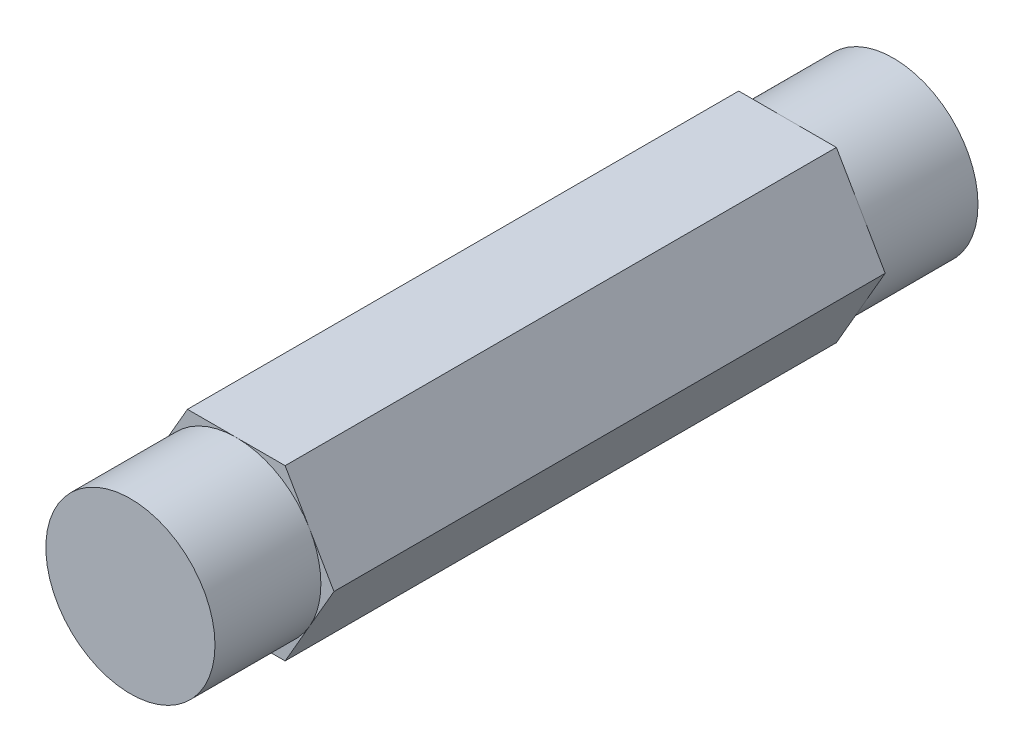
ISO-10303-21;
HEADER;
FILE_DESCRIPTION(('STEP AP214'),'2;1');
FILE_NAME('part.step','',(''),(''),'','','');
FILE_SCHEMA(('AUTOMOTIVE_DESIGN { 1 0 10303 214 1 1 1 1 }'));
ENDSEC;
DATA;
#1=APPLICATION_CONTEXT('core data for automotive mechanical design processes');
#2=APPLICATION_PROTOCOL_DEFINITION('international standard','automotive_design',2000,#1);
#3=PRODUCT_CONTEXT('',#1,'mechanical');
#4=PRODUCT('Part','Part','',(#3));
#5=PRODUCT_RELATED_PRODUCT_CATEGORY('part','',(#4));
#6=PRODUCT_DEFINITION_FORMATION('','',#4);
#7=PRODUCT_DEFINITION_CONTEXT('part definition',#1,'design');
#8=PRODUCT_DEFINITION('design','',#6,#7);
#9=PRODUCT_DEFINITION_SHAPE('','',#8);
#10=(LENGTH_UNIT() NAMED_UNIT(*) SI_UNIT(.MILLI.,.METRE.));
#11=(NAMED_UNIT(*) PLANE_ANGLE_UNIT() SI_UNIT($,.RADIAN.));
#12=(NAMED_UNIT(*) SI_UNIT($,.STERADIAN.) SOLID_ANGLE_UNIT());
#13=UNCERTAINTY_MEASURE_WITH_UNIT(LENGTH_MEASURE(1.E-05),#10,'distance_accuracy_value','');
#14=(GEOMETRIC_REPRESENTATION_CONTEXT(3) GLOBAL_UNCERTAINTY_ASSIGNED_CONTEXT((#13)) GLOBAL_UNIT_ASSIGNED_CONTEXT((#10,
#11,#12)) REPRESENTATION_CONTEXT('',''));
#15=CARTESIAN_POINT('',(0.,0.,0.));
#16=DIRECTION('',(0.,0.,1.));
#17=DIRECTION('',(1.,0.,0.));
#18=AXIS2_PLACEMENT_3D('',#15,#16,#17);
#19=CARTESIAN_POINT('',(0.,-6.35,28.64485));
#20=DIRECTION('',(0.,1.,0.));
#21=DIRECTION('',(-1.,0.,0.));
#22=AXIS2_PLACEMENT_3D('',#19,#20,#21);
#23=PLANE('',#22);
#24=DIRECTION('',(-1.,0.,0.));
#25=VECTOR('',#24,1.);
#26=CARTESIAN_POINT('',(0.,-6.35,-20.69465));
#27=LINE('',#26,#25);
#28=CARTESIAN_POINT('',(3.66617420935412,-6.35,-20.69465));
#29=VERTEX_POINT('',#28);
#30=CARTESIAN_POINT('',(0.,-6.35,-20.69465));
#31=VERTEX_POINT('',#30);
#32=EDGE_CURVE('E315',#29,#31,#27,.T.);
#33=ORIENTED_EDGE('',*,*,#32,.F.);
#34=DIRECTION('',(0.,0.,-1.));
#35=VECTOR('',#34,1.);
#36=CARTESIAN_POINT('',(3.66617420935412,-6.35,28.64485));
#37=LINE('',#36,#35);
#38=CARTESIAN_POINT('',(3.66617420935412,-6.35,20.69465));
#39=VERTEX_POINT('',#38);
#40=EDGE_CURVE('E228',#39,#29,#37,.T.);
#41=ORIENTED_EDGE('',*,*,#40,.F.);
#42=DIRECTION('',(1.,0.,0.));
#43=VECTOR('',#42,1.);
#44=CARTESIAN_POINT('',(0.,-6.35,20.69465));
#45=LINE('',#44,#43);
#46=CARTESIAN_POINT('',(0.,-6.35,20.69465));
#47=VERTEX_POINT('',#46);
#48=EDGE_CURVE('E207',#47,#39,#45,.T.);
#49=ORIENTED_EDGE('',*,*,#48,.F.);
#50=CARTESIAN_POINT('',(-3.66617420935412,-6.35,20.69465));
#51=VERTEX_POINT('',#50);
#52=EDGE_CURVE('E210',#51,#47,#45,.T.);
#53=ORIENTED_EDGE('',*,*,#52,.F.);
#54=DIRECTION('',(0.,0.,-1.));
#55=VECTOR('',#54,1.);
#56=CARTESIAN_POINT('',(-3.66617420935412,-6.35,28.64485));
#57=LINE('',#56,#55);
#58=CARTESIAN_POINT('',(-3.66617420935412,-6.35,-20.69465));
#59=VERTEX_POINT('',#58);
#60=EDGE_CURVE('E211',#51,#59,#57,.T.);
#61=ORIENTED_EDGE('',*,*,#60,.T.);
#62=EDGE_CURVE('E305',#31,#59,#27,.T.);
#63=ORIENTED_EDGE('',*,*,#62,.F.);
#64=EDGE_LOOP('',(#33,#41,#49,#53,#61,#63));
#65=FACE_BOUND('',#64,.T.);
#66=ADVANCED_FACE('F49',(#65),#23,.F.);
#67=CARTESIAN_POINT('',(5.49926131403119,-3.175,28.64485));
#68=DIRECTION('',(-0.866025403784439,0.5,0.));
#69=DIRECTION('',(-0.5,-0.866025403784439,0.));
#70=AXIS2_PLACEMENT_3D('',#67,#68,#69);
#71=PLANE('',#70);
#72=DIRECTION('',(-0.5,-0.866025403784439,0.));
#73=VECTOR('',#72,1.);
#74=CARTESIAN_POINT('',(5.49926131403119,-3.175,-20.69465));
#75=LINE('',#74,#73);
#76=CARTESIAN_POINT('',(7.33234841870825,0.,-20.69465));
#77=VERTEX_POINT('',#76);
#78=CARTESIAN_POINT('',(5.49926131403119,-3.175,-20.69465));
#79=VERTEX_POINT('',#78);
#80=EDGE_CURVE('E160',#77,#79,#75,.T.);
#81=ORIENTED_EDGE('',*,*,#80,.F.);
#82=DIRECTION('',(0.,0.,-1.));
#83=VECTOR('',#82,1.);
#84=CARTESIAN_POINT('',(7.33234841870825,0.,28.64485));
#85=LINE('',#84,#83);
#86=CARTESIAN_POINT('',(7.33234841870825,0.,20.69465));
#87=VERTEX_POINT('',#86);
#88=EDGE_CURVE('E178',#87,#77,#85,.T.);
#89=ORIENTED_EDGE('',*,*,#88,.F.);
#90=DIRECTION('',(0.5,0.866025403784439,0.));
#91=VECTOR('',#90,1.);
#92=CARTESIAN_POINT('',(5.49926131403119,-3.175,20.69465));
#93=LINE('',#92,#91);
#94=CARTESIAN_POINT('',(5.49926131403119,-3.175,20.69465));
#95=VERTEX_POINT('',#94);
#96=EDGE_CURVE('E203',#95,#87,#93,.T.);
#97=ORIENTED_EDGE('',*,*,#96,.F.);
#98=EDGE_CURVE('E206',#39,#95,#93,.T.);
#99=ORIENTED_EDGE('',*,*,#98,.F.);
#100=ORIENTED_EDGE('',*,*,#40,.T.);
#101=EDGE_CURVE('E185',#79,#29,#75,.T.);
#102=ORIENTED_EDGE('',*,*,#101,.F.);
#103=EDGE_LOOP('',(#81,#89,#97,#99,#100,#102));
#104=FACE_BOUND('',#103,.T.);
#105=ADVANCED_FACE('F326',(#104),#71,.F.);
#106=CARTESIAN_POINT('',(5.49926131403119,3.175,28.64485));
#107=DIRECTION('',(-0.866025403784438,-0.5,0.));
#108=DIRECTION('',(0.5,-0.866025403784439,0.));
#109=AXIS2_PLACEMENT_3D('',#106,#107,#108);
#110=PLANE('',#109);
#111=DIRECTION('',(0.5,-0.866025403784439,0.));
#112=VECTOR('',#111,1.);
#113=CARTESIAN_POINT('',(5.49926131403119,3.175,-20.69465));
#114=LINE('',#113,#112);
#115=CARTESIAN_POINT('',(3.66617420935412,6.35,-20.69465));
#116=VERTEX_POINT('',#115);
#117=CARTESIAN_POINT('',(5.49926131403118,3.175,-20.69465));
#118=VERTEX_POINT('',#117);
#119=EDGE_CURVE('E140',#116,#118,#114,.T.);
#120=ORIENTED_EDGE('',*,*,#119,.F.);
#121=DIRECTION('',(0.,0.,-1.));
#122=VECTOR('',#121,1.);
#123=CARTESIAN_POINT('',(3.66617420935412,6.35,28.64485));
#124=LINE('',#123,#122);
#125=CARTESIAN_POINT('',(3.66617420935412,6.35,20.69465));
#126=VERTEX_POINT('',#125);
#127=EDGE_CURVE('E223',#126,#116,#124,.T.);
#128=ORIENTED_EDGE('',*,*,#127,.F.);
#129=DIRECTION('',(-0.5,0.866025403784439,0.));
#130=VECTOR('',#129,1.);
#131=CARTESIAN_POINT('',(5.49926131403119,3.175,20.69465));
#132=LINE('',#131,#130);
#133=CARTESIAN_POINT('',(5.49926131403118,3.175,20.69465));
#134=VERTEX_POINT('',#133);
#135=EDGE_CURVE('E199',#134,#126,#132,.T.);
#136=ORIENTED_EDGE('',*,*,#135,.F.);
#137=EDGE_CURVE('E202',#87,#134,#132,.T.);
#138=ORIENTED_EDGE('',*,*,#137,.F.);
#139=ORIENTED_EDGE('',*,*,#88,.T.);
#140=EDGE_CURVE('E153',#118,#77,#114,.T.);
#141=ORIENTED_EDGE('',*,*,#140,.F.);
#142=EDGE_LOOP('',(#120,#128,#136,#138,#139,#141));
#143=FACE_BOUND('',#142,.T.);
#144=ADVANCED_FACE('F175',(#143),#110,.F.);
#145=CARTESIAN_POINT('',(0.,6.35,28.64485));
#146=DIRECTION('',(0.,-1.,0.));
#147=DIRECTION('',(1.,0.,0.));
#148=AXIS2_PLACEMENT_3D('',#145,#146,#147);
#149=PLANE('',#148);
#150=DIRECTION('',(1.,0.,0.));
#151=VECTOR('',#150,1.);
#152=CARTESIAN_POINT('',(0.,6.35,-20.69465));
#153=LINE('',#152,#151);
#154=CARTESIAN_POINT('',(-3.66617420935412,6.35,-20.69465));
#155=VERTEX_POINT('',#154);
#156=CARTESIAN_POINT('',(0.,6.35,-20.69465));
#157=VERTEX_POINT('',#156);
#158=EDGE_CURVE('E182',#155,#157,#153,.T.);
#159=ORIENTED_EDGE('',*,*,#158,.F.);
#160=DIRECTION('',(0.,0.,-1.));
#161=VECTOR('',#160,1.);
#162=CARTESIAN_POINT('',(-3.66617420935412,6.35,28.64485));
#163=LINE('',#162,#161);
#164=CARTESIAN_POINT('',(-3.66617420935412,6.35,20.69465));
#165=VERTEX_POINT('',#164);
#166=EDGE_CURVE('E219',#165,#155,#163,.T.);
#167=ORIENTED_EDGE('',*,*,#166,.F.);
#168=DIRECTION('',(-1.,0.,0.));
#169=VECTOR('',#168,1.);
#170=CARTESIAN_POINT('',(0.,6.35,20.69465));
#171=LINE('',#170,#169);
#172=CARTESIAN_POINT('',(0.,6.35,20.69465));
#173=VERTEX_POINT('',#172);
#174=EDGE_CURVE('E195',#173,#165,#171,.T.);
#175=ORIENTED_EDGE('',*,*,#174,.F.);
#176=EDGE_CURVE('E198',#126,#173,#171,.T.);
#177=ORIENTED_EDGE('',*,*,#176,.F.);
#178=ORIENTED_EDGE('',*,*,#127,.T.);
#179=EDGE_CURVE('E146',#157,#116,#153,.T.);
#180=ORIENTED_EDGE('',*,*,#179,.F.);
#181=EDGE_LOOP('',(#159,#167,#175,#177,#178,#180));
#182=FACE_BOUND('',#181,.T.);
#183=ADVANCED_FACE('F293',(#182),#149,.F.);
#184=CARTESIAN_POINT('',(-5.49926131403118,3.175,28.64485));
#185=DIRECTION('',(0.866025403784439,-0.5,0.));
#186=DIRECTION('',(0.5,0.866025403784439,0.));
#187=AXIS2_PLACEMENT_3D('',#184,#185,#186);
#188=PLANE('',#187);
#189=DIRECTION('',(0.5,0.866025403784439,0.));
#190=VECTOR('',#189,1.);
#191=CARTESIAN_POINT('',(-5.49926131403118,3.175,-20.69465));
#192=LINE('',#191,#190);
#193=CARTESIAN_POINT('',(-7.33234841870824,0.,-20.69465));
#194=VERTEX_POINT('',#193);
#195=CARTESIAN_POINT('',(-5.49926131403119,3.175,-20.69465));
#196=VERTEX_POINT('',#195);
#197=EDGE_CURVE('E173',#194,#196,#192,.T.);
#198=ORIENTED_EDGE('',*,*,#197,.F.);
#199=DIRECTION('',(0.,0.,-1.));
#200=VECTOR('',#199,1.);
#201=CARTESIAN_POINT('',(-7.33234841870824,0.,28.64485));
#202=LINE('',#201,#200);
#203=CARTESIAN_POINT('',(-7.33234841870824,0.,20.69465));
#204=VERTEX_POINT('',#203);
#205=EDGE_CURVE('E215',#204,#194,#202,.T.);
#206=ORIENTED_EDGE('',*,*,#205,.F.);
#207=DIRECTION('',(-0.5,-0.866025403784439,0.));
#208=VECTOR('',#207,1.);
#209=CARTESIAN_POINT('',(-5.49926131403118,3.175,20.69465));
#210=LINE('',#209,#208);
#211=CARTESIAN_POINT('',(-5.49926131403119,3.175,20.69465));
#212=VERTEX_POINT('',#211);
#213=EDGE_CURVE('E190',#212,#204,#210,.T.);
#214=ORIENTED_EDGE('',*,*,#213,.F.);
#215=EDGE_CURVE('E194',#165,#212,#210,.T.);
#216=ORIENTED_EDGE('',*,*,#215,.F.);
#217=ORIENTED_EDGE('',*,*,#166,.T.);
#218=EDGE_CURVE('E307',#196,#155,#192,.T.);
#219=ORIENTED_EDGE('',*,*,#218,.F.);
#220=EDGE_LOOP('',(#198,#206,#214,#216,#217,#219));
#221=FACE_BOUND('',#220,.T.);
#222=ADVANCED_FACE('F300',(#221),#188,.F.);
#223=CARTESIAN_POINT('',(-5.49926131403118,-3.175,28.64485));
#224=DIRECTION('',(0.866025403784439,0.5,0.));
#225=DIRECTION('',(-0.5,0.866025403784439,0.));
#226=AXIS2_PLACEMENT_3D('',#223,#224,#225);
#227=PLANE('',#226);
#228=DIRECTION('',(-0.5,0.866025403784439,0.));
#229=VECTOR('',#228,1.);
#230=CARTESIAN_POINT('',(-5.49926131403118,-3.175,-20.69465));
#231=LINE('',#230,#229);
#232=CARTESIAN_POINT('',(-5.49926131403118,-3.175,-20.69465));
#233=VERTEX_POINT('',#232);
#234=EDGE_CURVE('E12',#59,#233,#231,.T.);
#235=ORIENTED_EDGE('',*,*,#234,.F.);
#236=ORIENTED_EDGE('',*,*,#60,.F.);
#237=DIRECTION('',(0.5,-0.866025403784439,0.));
#238=VECTOR('',#237,1.);
#239=CARTESIAN_POINT('',(-5.49926131403118,-3.175,20.69465));
#240=LINE('',#239,#238);
#241=CARTESIAN_POINT('',(-5.49926131403118,-3.175,20.69465));
#242=VERTEX_POINT('',#241);
#243=EDGE_CURVE('E236',#242,#51,#240,.T.);
#244=ORIENTED_EDGE('',*,*,#243,.F.);
#245=EDGE_CURVE('E238',#204,#242,#240,.T.);
#246=ORIENTED_EDGE('',*,*,#245,.F.);
#247=ORIENTED_EDGE('',*,*,#205,.T.);
#248=EDGE_CURVE('E52',#233,#194,#231,.T.);
#249=ORIENTED_EDGE('',*,*,#248,.F.);
#250=EDGE_LOOP('',(#235,#236,#244,#246,#247,#249));
#251=FACE_BOUND('',#250,.T.);
#252=ADVANCED_FACE('F256',(#251),#227,.F.);
#253=CARTESIAN_POINT('',(0.,0.,20.69465));
#254=DIRECTION('',(0.,0.,1.));
#255=DIRECTION('',(1.,0.,0.));
#256=AXIS2_PLACEMENT_3D('',#253,#254,#255);
#257=PLANE('',#256);
#258=ORIENTED_EDGE('',*,*,#52,.T.);
#259=CARTESIAN_POINT('',(0.,0.,20.69465));
#260=DIRECTION('',(0.,0.,1.));
#261=DIRECTION('',(1.,0.,0.));
#262=AXIS2_PLACEMENT_3D('',#259,#260,#261);
#263=CIRCLE('',#262,6.35);
#264=EDGE_CURVE('E261',#242,#47,#263,.T.);
#265=ORIENTED_EDGE('',*,*,#264,.F.);
#266=ORIENTED_EDGE('',*,*,#243,.T.);
#267=EDGE_LOOP('',(#258,#265,#266));
#268=FACE_BOUND('',#267,.T.);
#269=ADVANCED_FACE('F259',(#268),#257,.T.);
#270=ORIENTED_EDGE('',*,*,#48,.T.);
#271=ORIENTED_EDGE('',*,*,#98,.T.);
#272=EDGE_CURVE('E276',#47,#95,#263,.T.);
#273=ORIENTED_EDGE('',*,*,#272,.F.);
#274=EDGE_LOOP('',(#270,#271,#273));
#275=FACE_BOUND('',#274,.T.);
#276=ADVANCED_FACE('F328',(#275),#257,.T.);
#277=ORIENTED_EDGE('',*,*,#96,.T.);
#278=ORIENTED_EDGE('',*,*,#137,.T.);
#279=EDGE_CURVE('E152',#95,#134,#263,.T.);
#280=ORIENTED_EDGE('',*,*,#279,.F.);
#281=EDGE_LOOP('',(#277,#278,#280));
#282=FACE_BOUND('',#281,.T.);
#283=ADVANCED_FACE('F330',(#282),#257,.T.);
#284=ORIENTED_EDGE('',*,*,#135,.T.);
#285=ORIENTED_EDGE('',*,*,#176,.T.);
#286=EDGE_CURVE('E186',#134,#173,#263,.T.);
#287=ORIENTED_EDGE('',*,*,#286,.F.);
#288=EDGE_LOOP('',(#284,#285,#287));
#289=FACE_BOUND('',#288,.T.);
#290=ADVANCED_FACE('F288',(#289),#257,.T.);
#291=ORIENTED_EDGE('',*,*,#174,.T.);
#292=ORIENTED_EDGE('',*,*,#215,.T.);
#293=EDGE_CURVE('E191',#173,#212,#263,.T.);
#294=ORIENTED_EDGE('',*,*,#293,.F.);
#295=EDGE_LOOP('',(#291,#292,#294));
#296=FACE_BOUND('',#295,.T.);
#297=ADVANCED_FACE('F297',(#296),#257,.T.);
#298=ORIENTED_EDGE('',*,*,#213,.T.);
#299=ORIENTED_EDGE('',*,*,#245,.T.);
#300=EDGE_CURVE('E72',#212,#242,#263,.T.);
#301=ORIENTED_EDGE('',*,*,#300,.F.);
#302=EDGE_LOOP('',(#298,#299,#301));
#303=FACE_BOUND('',#302,.T.);
#304=ADVANCED_FACE('F250',(#303),#257,.T.);
#305=CARTESIAN_POINT('',(0.,0.,20.69465));
#306=DIRECTION('',(0.,0.,1.));
#307=DIRECTION('',(1.,0.,0.));
#308=AXIS2_PLACEMENT_3D('',#305,#306,#307);
#309=CYLINDRICAL_SURFACE('',#308,6.35);
#310=CARTESIAN_POINT('',(0.,0.,28.64485));
#311=DIRECTION('',(0.,0.,1.));
#312=DIRECTION('',(1.,0.,0.));
#313=AXIS2_PLACEMENT_3D('',#310,#311,#312);
#314=CIRCLE('',#313,6.35);
#315=CARTESIAN_POINT('',(6.35,0.,28.64485));
#316=VERTEX_POINT('',#315);
#317=EDGE_CURVE('E232',#316,#316,#314,.T.);
#318=ORIENTED_EDGE('',*,*,#317,.F.);
#319=EDGE_LOOP('',(#318));
#320=FACE_BOUND('',#319,.T.);
#321=ORIENTED_EDGE('',*,*,#264,.T.);
#322=ORIENTED_EDGE('',*,*,#272,.T.);
#323=ORIENTED_EDGE('',*,*,#279,.T.);
#324=ORIENTED_EDGE('',*,*,#286,.T.);
#325=ORIENTED_EDGE('',*,*,#293,.T.);
#326=ORIENTED_EDGE('',*,*,#300,.T.);
#327=EDGE_LOOP('',(#321,#322,#323,#324,#325,#326));
#328=FACE_BOUND('',#327,.T.);
#329=ADVANCED_FACE('F282',(#320,#328),#309,.T.);
#330=CARTESIAN_POINT('',(0.,0.,28.64485));
#331=DIRECTION('',(0.,0.,1.));
#332=DIRECTION('',(1.,0.,0.));
#333=AXIS2_PLACEMENT_3D('',#330,#331,#332);
#334=PLANE('',#333);
#335=ORIENTED_EDGE('',*,*,#317,.T.);
#336=EDGE_LOOP('',(#335));
#337=FACE_BOUND('',#336,.T.);
#338=ADVANCED_FACE('F356',(#337),#334,.T.);
#339=CARTESIAN_POINT('',(0.,0.,-20.69465));
#340=DIRECTION('',(0.,0.,-1.));
#341=DIRECTION('',(-1.,0.,0.));
#342=AXIS2_PLACEMENT_3D('',#339,#340,#341);
#343=PLANE('',#342);
#344=ORIENTED_EDGE('',*,*,#119,.T.);
#345=CARTESIAN_POINT('',(0.,0.,-20.69465));
#346=DIRECTION('',(0.,0.,1.));
#347=DIRECTION('',(1.,0.,0.));
#348=AXIS2_PLACEMENT_3D('',#345,#346,#347);
#349=CIRCLE('',#348,6.35);
#350=EDGE_CURVE('E144',#118,#157,#349,.T.);
#351=ORIENTED_EDGE('',*,*,#350,.T.);
#352=ORIENTED_EDGE('',*,*,#179,.T.);
#353=EDGE_LOOP('',(#344,#351,#352));
#354=FACE_BOUND('',#353,.T.);
#355=ADVANCED_FACE('F142',(#354),#343,.T.);
#356=ORIENTED_EDGE('',*,*,#140,.T.);
#357=ORIENTED_EDGE('',*,*,#80,.T.);
#358=EDGE_CURVE('E157',#79,#118,#349,.T.);
#359=ORIENTED_EDGE('',*,*,#358,.T.);
#360=EDGE_LOOP('',(#356,#357,#359));
#361=FACE_BOUND('',#360,.T.);
#362=ADVANCED_FACE('F158',(#361),#343,.T.);
#363=ORIENTED_EDGE('',*,*,#101,.T.);
#364=ORIENTED_EDGE('',*,*,#32,.T.);
#365=EDGE_CURVE('E165',#31,#79,#349,.T.);
#366=ORIENTED_EDGE('',*,*,#365,.T.);
#367=EDGE_LOOP('',(#363,#364,#366));
#368=FACE_BOUND('',#367,.T.);
#369=ADVANCED_FACE('F379',(#368),#343,.T.);
#370=ORIENTED_EDGE('',*,*,#158,.T.);
#371=EDGE_CURVE('E171',#157,#196,#349,.T.);
#372=ORIENTED_EDGE('',*,*,#371,.T.);
#373=ORIENTED_EDGE('',*,*,#218,.T.);
#374=EDGE_LOOP('',(#370,#372,#373));
#375=FACE_BOUND('',#374,.T.);
#376=ADVANCED_FACE('F312',(#375),#343,.T.);
#377=ORIENTED_EDGE('',*,*,#62,.T.);
#378=ORIENTED_EDGE('',*,*,#234,.T.);
#379=EDGE_CURVE('E309',#233,#31,#349,.T.);
#380=ORIENTED_EDGE('',*,*,#379,.T.);
#381=EDGE_LOOP('',(#377,#378,#380));
#382=FACE_BOUND('',#381,.T.);
#383=ADVANCED_FACE('F321',(#382),#343,.T.);
#384=ORIENTED_EDGE('',*,*,#197,.T.);
#385=EDGE_CURVE('E64',#196,#233,#349,.T.);
#386=ORIENTED_EDGE('',*,*,#385,.T.);
#387=ORIENTED_EDGE('',*,*,#248,.T.);
#388=EDGE_LOOP('',(#384,#386,#387));
#389=FACE_BOUND('',#388,.T.);
#390=ADVANCED_FACE('F303',(#389),#343,.T.);
#391=CARTESIAN_POINT('',(0.,0.,-20.69465));
#392=DIRECTION('',(0.,0.,-1.));
#393=DIRECTION('',(-1.,0.,0.));
#394=AXIS2_PLACEMENT_3D('',#391,#392,#393);
#395=CYLINDRICAL_SURFACE('',#394,6.35);
#396=ORIENTED_EDGE('',*,*,#365,.F.);
#397=ORIENTED_EDGE('',*,*,#379,.F.);
#398=ORIENTED_EDGE('',*,*,#385,.F.);
#399=ORIENTED_EDGE('',*,*,#371,.F.);
#400=ORIENTED_EDGE('',*,*,#350,.F.);
#401=ORIENTED_EDGE('',*,*,#358,.F.);
#402=EDGE_LOOP('',(#396,#397,#398,#399,#400,#401));
#403=FACE_BOUND('',#402,.T.);
#404=CARTESIAN_POINT('',(0.,0.,-28.64485));
#405=DIRECTION('',(0.,0.,1.));
#406=DIRECTION('',(1.,0.,0.));
#407=AXIS2_PLACEMENT_3D('',#404,#405,#406);
#408=CIRCLE('',#407,6.35);
#409=CARTESIAN_POINT('',(6.35,0.,-28.64485));
#410=VERTEX_POINT('',#409);
#411=EDGE_CURVE('E239',#410,#410,#408,.F.);
#412=ORIENTED_EDGE('',*,*,#411,.F.);
#413=EDGE_LOOP('',(#412));
#414=FACE_BOUND('',#413,.T.);
#415=ADVANCED_FACE('F168',(#403,#414),#395,.T.);
#416=CARTESIAN_POINT('',(0.,0.,-28.64485));
#417=DIRECTION('',(0.,0.,1.));
#418=DIRECTION('',(1.,0.,0.));
#419=AXIS2_PLACEMENT_3D('',#416,#417,#418);
#420=PLANE('',#419);
#421=ORIENTED_EDGE('',*,*,#411,.T.);
#422=EDGE_LOOP('',(#421));
#423=FACE_BOUND('',#422,.T.);
#424=ADVANCED_FACE('F354',(#423),#420,.F.);
#425=CLOSED_SHELL('',(#66,#105,#144,#183,#222,#252,#269,#276,#283,#290,#297,#304,#329,#338,#355,
#362,#369,#376,#383,#390,#415,#424));
#426=MANIFOLD_SOLID_BREP('B2',#425);
#427=ADVANCED_BREP_SHAPE_REPRESENTATION('',(#18,#426),#14);
#428=SHAPE_DEFINITION_REPRESENTATION(#9,#427);
ENDSEC;
END-ISO-10303-21;
